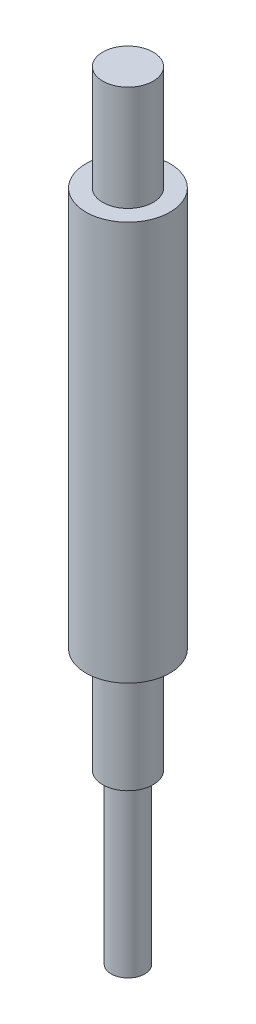
ISO-10303-21;
HEADER;
FILE_DESCRIPTION(('STEP AP214'),'2;1');
FILE_NAME('part.step','',(''),(''),'','','');
FILE_SCHEMA(('AUTOMOTIVE_DESIGN { 1 0 10303 214 1 1 1 1 }'));
ENDSEC;
DATA;
#1=APPLICATION_CONTEXT('core data for automotive mechanical design processes');
#2=APPLICATION_PROTOCOL_DEFINITION('international standard','automotive_design',2000,#1);
#3=PRODUCT_CONTEXT('',#1,'mechanical');
#4=PRODUCT('Part','Part','',(#3));
#5=PRODUCT_RELATED_PRODUCT_CATEGORY('part','',(#4));
#6=PRODUCT_DEFINITION_FORMATION('','',#4);
#7=PRODUCT_DEFINITION_CONTEXT('part definition',#1,'design');
#8=PRODUCT_DEFINITION('design','',#6,#7);
#9=PRODUCT_DEFINITION_SHAPE('','',#8);
#10=(LENGTH_UNIT() NAMED_UNIT(*) SI_UNIT(.MILLI.,.METRE.));
#11=(NAMED_UNIT(*) PLANE_ANGLE_UNIT() SI_UNIT($,.RADIAN.));
#12=(NAMED_UNIT(*) SI_UNIT($,.STERADIAN.) SOLID_ANGLE_UNIT());
#13=UNCERTAINTY_MEASURE_WITH_UNIT(LENGTH_MEASURE(1.E-05),#10,'distance_accuracy_value','');
#14=(GEOMETRIC_REPRESENTATION_CONTEXT(3) GLOBAL_UNCERTAINTY_ASSIGNED_CONTEXT((#13)) GLOBAL_UNIT_ASSIGNED_CONTEXT((#10,
#11,#12)) REPRESENTATION_CONTEXT('',''));
#15=CARTESIAN_POINT('',(0.,0.,0.));
#16=DIRECTION('',(0.,0.,1.));
#17=DIRECTION('',(1.,0.,0.));
#18=AXIS2_PLACEMENT_3D('',#15,#16,#17);
#19=CARTESIAN_POINT('',(0.,40.,0.));
#20=DIRECTION('',(0.,-1.,0.));
#21=DIRECTION('',(0.,0.,-1.));
#22=AXIS2_PLACEMENT_3D('',#19,#20,#21);
#23=CYLINDRICAL_SURFACE('',#22,4.);
#24=CARTESIAN_POINT('',(0.,40.,0.));
#25=DIRECTION('',(0.,1.,0.));
#26=DIRECTION('',(0.,0.,1.));
#27=AXIS2_PLACEMENT_3D('',#24,#25,#26);
#28=CIRCLE('',#27,4.);
#29=CARTESIAN_POINT('',(0.,40.,4.));
#30=VERTEX_POINT('',#29);
#31=EDGE_CURVE('E10',#30,#30,#28,.T.);
#32=ORIENTED_EDGE('',*,*,#31,.F.);
#33=EDGE_LOOP('',(#32));
#34=FACE_BOUND('',#33,.T.);
#35=CARTESIAN_POINT('',(0.,0.,0.));
#36=DIRECTION('',(0.,1.,0.));
#37=DIRECTION('',(0.,0.,1.));
#38=AXIS2_PLACEMENT_3D('',#35,#36,#37);
#39=CIRCLE('',#38,4.);
#40=CARTESIAN_POINT('',(0.,0.,4.));
#41=VERTEX_POINT('',#40);
#42=EDGE_CURVE('E36',#41,#41,#39,.T.);
#43=ORIENTED_EDGE('',*,*,#42,.T.);
#44=EDGE_LOOP('',(#43));
#45=FACE_BOUND('',#44,.T.);
#46=ADVANCED_FACE('F33',(#34,#45),#23,.T.);
#47=CARTESIAN_POINT('',(0.,0.,0.));
#48=DIRECTION('',(0.,1.,0.));
#49=DIRECTION('',(0.,0.,1.));
#50=AXIS2_PLACEMENT_3D('',#47,#48,#49);
#51=PLANE('',#50);
#52=ORIENTED_EDGE('',*,*,#42,.F.);
#53=EDGE_LOOP('',(#52));
#54=FACE_BOUND('',#53,.T.);
#55=ADVANCED_FACE('F91',(#54),#51,.F.);
#56=CARTESIAN_POINT('',(0.,65.,0.));
#57=DIRECTION('',(0.,-1.,0.));
#58=DIRECTION('',(0.,0.,-1.));
#59=AXIS2_PLACEMENT_3D('',#56,#57,#58);
#60=CYLINDRICAL_SURFACE('',#59,6.);
#61=CARTESIAN_POINT('',(0.,65.,0.));
#62=DIRECTION('',(0.,1.,0.));
#63=DIRECTION('',(0.,0.,1.));
#64=AXIS2_PLACEMENT_3D('',#61,#62,#63);
#65=CIRCLE('',#64,6.);
#66=CARTESIAN_POINT('',(0.,65.,6.));
#67=VERTEX_POINT('',#66);
#68=EDGE_CURVE('E43',#67,#67,#65,.T.);
#69=ORIENTED_EDGE('',*,*,#68,.F.);
#70=EDGE_LOOP('',(#69));
#71=FACE_BOUND('',#70,.T.);
#72=CARTESIAN_POINT('',(0.,40.,0.));
#73=DIRECTION('',(0.,1.,0.));
#74=DIRECTION('',(0.,0.,1.));
#75=AXIS2_PLACEMENT_3D('',#72,#73,#74);
#76=CIRCLE('',#75,6.);
#77=CARTESIAN_POINT('',(0.,40.,6.));
#78=VERTEX_POINT('',#77);
#79=EDGE_CURVE('E45',#78,#78,#76,.T.);
#80=ORIENTED_EDGE('',*,*,#79,.T.);
#81=EDGE_LOOP('',(#80));
#82=FACE_BOUND('',#81,.T.);
#83=ADVANCED_FACE('F96',(#71,#82),#60,.T.);
#84=CARTESIAN_POINT('',(0.,40.,0.));
#85=DIRECTION('',(0.,1.,0.));
#86=DIRECTION('',(0.,0.,1.));
#87=AXIS2_PLACEMENT_3D('',#84,#85,#86);
#88=PLANE('',#87);
#89=ORIENTED_EDGE('',*,*,#31,.T.);
#90=EDGE_LOOP('',(#89));
#91=FACE_BOUND('',#90,.T.);
#92=ORIENTED_EDGE('',*,*,#79,.F.);
#93=EDGE_LOOP('',(#92));
#94=FACE_BOUND('',#93,.T.);
#95=ADVANCED_FACE('F81',(#91,#94),#88,.F.);
#96=CARTESIAN_POINT('',(0.,160.,0.));
#97=DIRECTION('',(0.,-1.,0.));
#98=DIRECTION('',(0.,0.,-1.));
#99=AXIS2_PLACEMENT_3D('',#96,#97,#98);
#100=CYLINDRICAL_SURFACE('',#99,10.);
#101=CARTESIAN_POINT('',(0.,160.,0.));
#102=DIRECTION('',(0.,1.,0.));
#103=DIRECTION('',(0.,0.,1.));
#104=AXIS2_PLACEMENT_3D('',#101,#102,#103);
#105=CIRCLE('',#104,10.);
#106=CARTESIAN_POINT('',(0.,160.,10.));
#107=VERTEX_POINT('',#106);
#108=EDGE_CURVE('E48',#107,#107,#105,.T.);
#109=ORIENTED_EDGE('',*,*,#108,.F.);
#110=EDGE_LOOP('',(#109));
#111=FACE_BOUND('',#110,.T.);
#112=CARTESIAN_POINT('',(0.,65.,0.));
#113=DIRECTION('',(0.,1.,0.));
#114=DIRECTION('',(0.,0.,1.));
#115=AXIS2_PLACEMENT_3D('',#112,#113,#114);
#116=CIRCLE('',#115,10.);
#117=CARTESIAN_POINT('',(0.,65.,10.));
#118=VERTEX_POINT('',#117);
#119=EDGE_CURVE('E51',#118,#118,#116,.T.);
#120=ORIENTED_EDGE('',*,*,#119,.T.);
#121=EDGE_LOOP('',(#120));
#122=FACE_BOUND('',#121,.T.);
#123=ADVANCED_FACE('F75',(#111,#122),#100,.T.);
#124=CARTESIAN_POINT('',(0.,160.,0.));
#125=DIRECTION('',(0.,1.,0.));
#126=DIRECTION('',(0.,0.,1.));
#127=AXIS2_PLACEMENT_3D('',#124,#125,#126);
#128=PLANE('',#127);
#129=CARTESIAN_POINT('',(0.,160.,0.));
#130=DIRECTION('',(0.,1.,0.));
#131=DIRECTION('',(0.,0.,1.));
#132=AXIS2_PLACEMENT_3D('',#129,#130,#131);
#133=CIRCLE('',#132,6.);
#134=CARTESIAN_POINT('',(0.,160.,6.));
#135=VERTEX_POINT('',#134);
#136=EDGE_CURVE('E57',#135,#135,#133,.T.);
#137=ORIENTED_EDGE('',*,*,#136,.F.);
#138=EDGE_LOOP('',(#137));
#139=FACE_BOUND('',#138,.T.);
#140=ORIENTED_EDGE('',*,*,#108,.T.);
#141=EDGE_LOOP('',(#140));
#142=FACE_BOUND('',#141,.T.);
#143=ADVANCED_FACE('F72',(#139,#142),#128,.T.);
#144=CARTESIAN_POINT('',(0.,65.,0.));
#145=DIRECTION('',(0.,1.,0.));
#146=DIRECTION('',(0.,0.,1.));
#147=AXIS2_PLACEMENT_3D('',#144,#145,#146);
#148=PLANE('',#147);
#149=ORIENTED_EDGE('',*,*,#68,.T.);
#150=EDGE_LOOP('',(#149));
#151=FACE_BOUND('',#150,.T.);
#152=ORIENTED_EDGE('',*,*,#119,.F.);
#153=EDGE_LOOP('',(#152));
#154=FACE_BOUND('',#153,.T.);
#155=ADVANCED_FACE('F68',(#151,#154),#148,.F.);
#156=CARTESIAN_POINT('',(0.,185.,0.));
#157=DIRECTION('',(0.,-1.,0.));
#158=DIRECTION('',(0.,0.,-1.));
#159=AXIS2_PLACEMENT_3D('',#156,#157,#158);
#160=CYLINDRICAL_SURFACE('',#159,6.);
#161=CARTESIAN_POINT('',(0.,185.,0.));
#162=DIRECTION('',(0.,1.,0.));
#163=DIRECTION('',(0.,0.,1.));
#164=AXIS2_PLACEMENT_3D('',#161,#162,#163);
#165=CIRCLE('',#164,6.);
#166=CARTESIAN_POINT('',(0.,185.,6.));
#167=VERTEX_POINT('',#166);
#168=EDGE_CURVE('E54',#167,#167,#165,.T.);
#169=ORIENTED_EDGE('',*,*,#168,.F.);
#170=EDGE_LOOP('',(#169));
#171=FACE_BOUND('',#170,.T.);
#172=ORIENTED_EDGE('',*,*,#136,.T.);
#173=EDGE_LOOP('',(#172));
#174=FACE_BOUND('',#173,.T.);
#175=ADVANCED_FACE('F65',(#171,#174),#160,.T.);
#176=CARTESIAN_POINT('',(0.,185.,0.));
#177=DIRECTION('',(0.,1.,0.));
#178=DIRECTION('',(0.,0.,1.));
#179=AXIS2_PLACEMENT_3D('',#176,#177,#178);
#180=PLANE('',#179);
#181=ORIENTED_EDGE('',*,*,#168,.T.);
#182=EDGE_LOOP('',(#181));
#183=FACE_BOUND('',#182,.T.);
#184=ADVANCED_FACE('F63',(#183),#180,.T.);
#185=CLOSED_SHELL('',(#46,#55,#83,#95,#123,#143,#155,#175,#184));
#186=MANIFOLD_SOLID_BREP('B2',#185);
#187=ADVANCED_BREP_SHAPE_REPRESENTATION('',(#18,#186),#14);
#188=SHAPE_DEFINITION_REPRESENTATION(#9,#187);
ENDSEC;
END-ISO-10303-21;
